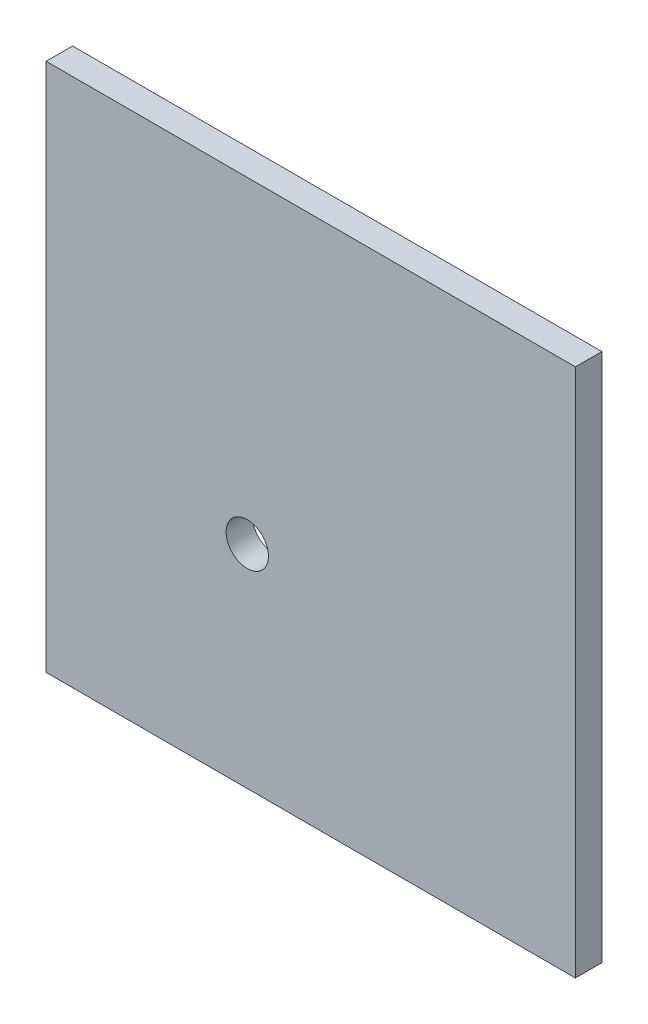
ISO-10303-21;
HEADER;
FILE_DESCRIPTION(('STEP AP214'),'2;1');
FILE_NAME('part.step','',(''),(''),'','','');
FILE_SCHEMA(('AUTOMOTIVE_DESIGN { 1 0 10303 214 1 1 1 1 }'));
ENDSEC;
DATA;
#1=APPLICATION_CONTEXT('core data for automotive mechanical design processes');
#2=APPLICATION_PROTOCOL_DEFINITION('international standard','automotive_design',2000,#1);
#3=PRODUCT_CONTEXT('',#1,'mechanical');
#4=PRODUCT('Part','Part','',(#3));
#5=PRODUCT_RELATED_PRODUCT_CATEGORY('part','',(#4));
#6=PRODUCT_DEFINITION_FORMATION('','',#4);
#7=PRODUCT_DEFINITION_CONTEXT('part definition',#1,'design');
#8=PRODUCT_DEFINITION('design','',#6,#7);
#9=PRODUCT_DEFINITION_SHAPE('','',#8);
#10=(LENGTH_UNIT() NAMED_UNIT(*) SI_UNIT(.MILLI.,.METRE.));
#11=(NAMED_UNIT(*) PLANE_ANGLE_UNIT() SI_UNIT($,.RADIAN.));
#12=(NAMED_UNIT(*) SI_UNIT($,.STERADIAN.) SOLID_ANGLE_UNIT());
#13=UNCERTAINTY_MEASURE_WITH_UNIT(LENGTH_MEASURE(1.E-05),#10,'distance_accuracy_value','');
#14=(GEOMETRIC_REPRESENTATION_CONTEXT(3) GLOBAL_UNCERTAINTY_ASSIGNED_CONTEXT((#13)) GLOBAL_UNIT_ASSIGNED_CONTEXT((#10,
#11,#12)) REPRESENTATION_CONTEXT('',''));
#15=CARTESIAN_POINT('',(0.,0.,0.));
#16=DIRECTION('',(0.,0.,1.));
#17=DIRECTION('',(1.,0.,0.));
#18=AXIS2_PLACEMENT_3D('',#15,#16,#17);
#19=CARTESIAN_POINT('',(50.,50.,5.));
#20=DIRECTION('',(-1.,0.,0.));
#21=DIRECTION('',(0.,-1.,0.));
#22=AXIS2_PLACEMENT_3D('',#19,#20,#21);
#23=PLANE('',#22);
#24=DIRECTION('',(0.,1.,0.));
#25=VECTOR('',#24,1.);
#26=CARTESIAN_POINT('',(50.,50.,0.));
#27=LINE('',#26,#25);
#28=CARTESIAN_POINT('',(50.,-50.,0.));
#29=VERTEX_POINT('',#28);
#30=CARTESIAN_POINT('',(50.,50.,0.));
#31=VERTEX_POINT('',#30);
#32=EDGE_CURVE('E96',#29,#31,#27,.T.);
#33=ORIENTED_EDGE('',*,*,#32,.T.);
#34=DIRECTION('',(0.,0.,-1.));
#35=VECTOR('',#34,1.);
#36=CARTESIAN_POINT('',(50.,50.,5.));
#37=LINE('',#36,#35);
#38=CARTESIAN_POINT('',(50.,50.,5.));
#39=VERTEX_POINT('',#38);
#40=EDGE_CURVE('E11',#39,#31,#37,.T.);
#41=ORIENTED_EDGE('',*,*,#40,.F.);
#42=DIRECTION('',(0.,1.,0.));
#43=VECTOR('',#42,1.);
#44=CARTESIAN_POINT('',(50.,50.,5.));
#45=LINE('',#44,#43);
#46=CARTESIAN_POINT('',(50.,-50.,5.));
#47=VERTEX_POINT('',#46);
#48=EDGE_CURVE('E84',#47,#39,#45,.T.);
#49=ORIENTED_EDGE('',*,*,#48,.F.);
#50=DIRECTION('',(0.,0.,-1.));
#51=VECTOR('',#50,1.);
#52=CARTESIAN_POINT('',(50.,-50.,5.));
#53=LINE('',#52,#51);
#54=EDGE_CURVE('E92',#47,#29,#53,.T.);
#55=ORIENTED_EDGE('',*,*,#54,.T.);
#56=EDGE_LOOP('',(#33,#41,#49,#55));
#57=FACE_BOUND('',#56,.T.);
#58=ADVANCED_FACE('F33',(#57),#23,.F.);
#59=CARTESIAN_POINT('',(-50.,50.,5.));
#60=DIRECTION('',(0.,-1.,0.));
#61=DIRECTION('',(0.,0.,-1.));
#62=AXIS2_PLACEMENT_3D('',#59,#60,#61);
#63=PLANE('',#62);
#64=DIRECTION('',(-1.,0.,0.));
#65=VECTOR('',#64,1.);
#66=CARTESIAN_POINT('',(-50.,50.,0.));
#67=LINE('',#66,#65);
#68=CARTESIAN_POINT('',(-50.,50.,0.));
#69=VERTEX_POINT('',#68);
#70=EDGE_CURVE('E88',#31,#69,#67,.T.);
#71=ORIENTED_EDGE('',*,*,#70,.T.);
#72=DIRECTION('',(0.,0.,-1.));
#73=VECTOR('',#72,1.);
#74=CARTESIAN_POINT('',(-50.,50.,5.));
#75=LINE('',#74,#73);
#76=CARTESIAN_POINT('',(-50.,50.,5.));
#77=VERTEX_POINT('',#76);
#78=EDGE_CURVE('E41',#77,#69,#75,.T.);
#79=ORIENTED_EDGE('',*,*,#78,.F.);
#80=DIRECTION('',(-1.,0.,0.));
#81=VECTOR('',#80,1.);
#82=CARTESIAN_POINT('',(-50.,50.,5.));
#83=LINE('',#82,#81);
#84=EDGE_CURVE('E79',#39,#77,#83,.T.);
#85=ORIENTED_EDGE('',*,*,#84,.F.);
#86=ORIENTED_EDGE('',*,*,#40,.T.);
#87=EDGE_LOOP('',(#71,#79,#85,#86));
#88=FACE_BOUND('',#87,.T.);
#89=ADVANCED_FACE('F87',(#88),#63,.F.);
#90=CARTESIAN_POINT('',(-50.,50.,5.));
#91=DIRECTION('',(1.,0.,0.));
#92=DIRECTION('',(0.,1.,0.));
#93=AXIS2_PLACEMENT_3D('',#90,#91,#92);
#94=PLANE('',#93);
#95=DIRECTION('',(0.,-1.,0.));
#96=VECTOR('',#95,1.);
#97=CARTESIAN_POINT('',(-50.,50.,0.));
#98=LINE('',#97,#96);
#99=CARTESIAN_POINT('',(-50.,-50.,0.));
#100=VERTEX_POINT('',#99);
#101=EDGE_CURVE('E66',#69,#100,#98,.T.);
#102=ORIENTED_EDGE('',*,*,#101,.T.);
#103=DIRECTION('',(0.,0.,-1.));
#104=VECTOR('',#103,1.);
#105=CARTESIAN_POINT('',(-50.,-50.,5.));
#106=LINE('',#105,#104);
#107=CARTESIAN_POINT('',(-50.,-50.,5.));
#108=VERTEX_POINT('',#107);
#109=EDGE_CURVE('E89',#108,#100,#106,.T.);
#110=ORIENTED_EDGE('',*,*,#109,.F.);
#111=DIRECTION('',(0.,-1.,0.));
#112=VECTOR('',#111,1.);
#113=CARTESIAN_POINT('',(-50.,50.,5.));
#114=LINE('',#113,#112);
#115=EDGE_CURVE('E82',#77,#108,#114,.T.);
#116=ORIENTED_EDGE('',*,*,#115,.F.);
#117=ORIENTED_EDGE('',*,*,#78,.T.);
#118=EDGE_LOOP('',(#102,#110,#116,#117));
#119=FACE_BOUND('',#118,.T.);
#120=ADVANCED_FACE('F90',(#119),#94,.F.);
#121=CARTESIAN_POINT('',(-50.,-50.,5.));
#122=DIRECTION('',(0.,1.,0.));
#123=DIRECTION('',(0.,0.,1.));
#124=AXIS2_PLACEMENT_3D('',#121,#122,#123);
#125=PLANE('',#124);
#126=DIRECTION('',(1.,0.,0.));
#127=VECTOR('',#126,1.);
#128=CARTESIAN_POINT('',(-50.,-50.,0.));
#129=LINE('',#128,#127);
#130=EDGE_CURVE('E72',#100,#29,#129,.T.);
#131=ORIENTED_EDGE('',*,*,#130,.T.);
#132=ORIENTED_EDGE('',*,*,#54,.F.);
#133=DIRECTION('',(1.,0.,0.));
#134=VECTOR('',#133,1.);
#135=CARTESIAN_POINT('',(-50.,-50.,5.));
#136=LINE('',#135,#134);
#137=EDGE_CURVE('E49',#108,#47,#136,.T.);
#138=ORIENTED_EDGE('',*,*,#137,.F.);
#139=ORIENTED_EDGE('',*,*,#109,.T.);
#140=EDGE_LOOP('',(#131,#132,#138,#139));
#141=FACE_BOUND('',#140,.T.);
#142=ADVANCED_FACE('F104',(#141),#125,.F.);
#143=CARTESIAN_POINT('',(0.,0.,5.));
#144=DIRECTION('',(0.,0.,1.));
#145=DIRECTION('',(1.,0.,0.));
#146=AXIS2_PLACEMENT_3D('',#143,#144,#145);
#147=PLANE('',#146);
#148=CARTESIAN_POINT('',(-12.,-10.,5.));
#149=DIRECTION('',(0.,0.,1.));
#150=DIRECTION('',(1.,0.,0.));
#151=AXIS2_PLACEMENT_3D('',#148,#149,#150);
#152=CIRCLE('',#151,4.);
#153=CARTESIAN_POINT('',(-8.00000000000001,-10.,5.));
#154=VERTEX_POINT('',#153);
#155=EDGE_CURVE('E112',#154,#154,#152,.T.);
#156=ORIENTED_EDGE('',*,*,#155,.F.);
#157=EDGE_LOOP('',(#156));
#158=FACE_BOUND('',#157,.T.);
#159=ORIENTED_EDGE('',*,*,#48,.T.);
#160=ORIENTED_EDGE('',*,*,#84,.T.);
#161=ORIENTED_EDGE('',*,*,#115,.T.);
#162=ORIENTED_EDGE('',*,*,#137,.T.);
#163=EDGE_LOOP('',(#159,#160,#161,#162));
#164=FACE_BOUND('',#163,.T.);
#165=ADVANCED_FACE('F80',(#158,#164),#147,.T.);
#166=CARTESIAN_POINT('',(0.,0.,0.));
#167=DIRECTION('',(0.,0.,1.));
#168=DIRECTION('',(1.,0.,0.));
#169=AXIS2_PLACEMENT_3D('',#166,#167,#168);
#170=PLANE('',#169);
#171=CARTESIAN_POINT('',(-12.,-10.,0.));
#172=DIRECTION('',(0.,0.,1.));
#173=DIRECTION('',(1.,0.,0.));
#174=AXIS2_PLACEMENT_3D('',#171,#172,#173);
#175=CIRCLE('',#174,4.);
#176=CARTESIAN_POINT('',(-8.00000000000001,-10.,0.));
#177=VERTEX_POINT('',#176);
#178=EDGE_CURVE('E99',#177,#177,#175,.F.);
#179=ORIENTED_EDGE('',*,*,#178,.F.);
#180=EDGE_LOOP('',(#179));
#181=FACE_BOUND('',#180,.T.);
#182=ORIENTED_EDGE('',*,*,#32,.F.);
#183=ORIENTED_EDGE('',*,*,#130,.F.);
#184=ORIENTED_EDGE('',*,*,#101,.F.);
#185=ORIENTED_EDGE('',*,*,#70,.F.);
#186=EDGE_LOOP('',(#182,#183,#184,#185));
#187=FACE_BOUND('',#186,.T.);
#188=ADVANCED_FACE('F107',(#181,#187),#170,.F.);
#189=CARTESIAN_POINT('',(-12.,-10.,-0.00100000000000013));
#190=DIRECTION('',(0.,0.,1.));
#191=DIRECTION('',(1.,0.,0.));
#192=AXIS2_PLACEMENT_3D('',#189,#190,#191);
#193=CYLINDRICAL_SURFACE('',#192,4.);
#194=ORIENTED_EDGE('',*,*,#155,.T.);
#195=EDGE_LOOP('',(#194));
#196=FACE_BOUND('',#195,.T.);
#197=ORIENTED_EDGE('',*,*,#178,.T.);
#198=EDGE_LOOP('',(#197));
#199=FACE_BOUND('',#198,.T.);
#200=ADVANCED_FACE('F116',(#196,#199),#193,.F.);
#201=CLOSED_SHELL('',(#58,#89,#120,#142,#165,#188,#200));
#202=MANIFOLD_SOLID_BREP('B2',#201);
#203=ADVANCED_BREP_SHAPE_REPRESENTATION('',(#18,#202),#14);
#204=SHAPE_DEFINITION_REPRESENTATION(#9,#203);
ENDSEC;
END-ISO-10303-21;
